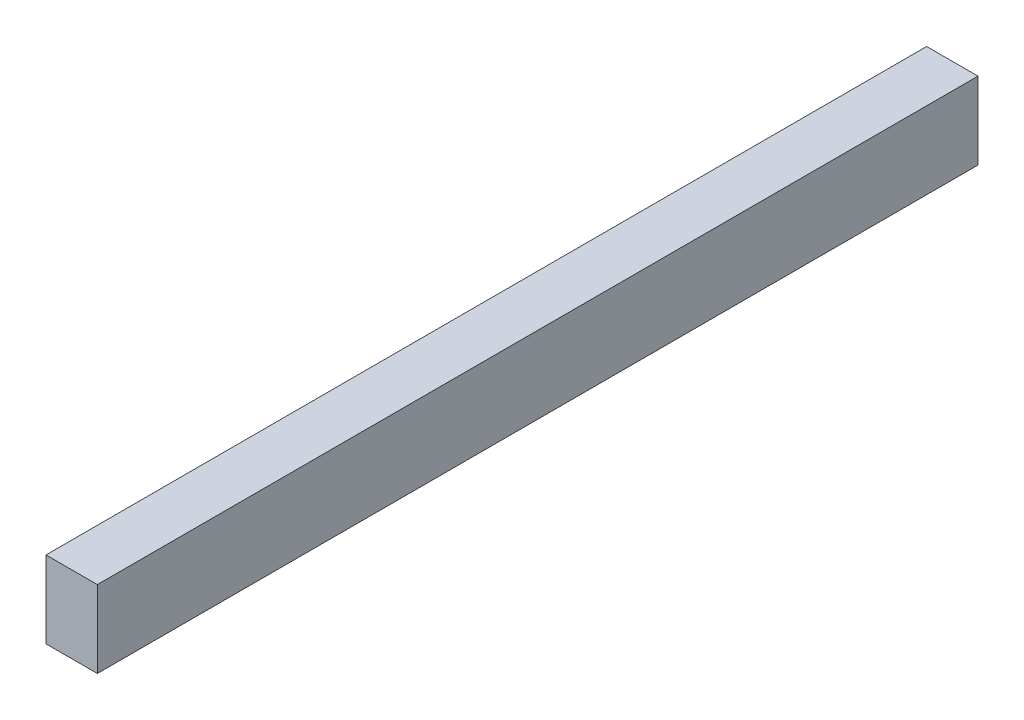
ISO-10303-21;
HEADER;
FILE_DESCRIPTION(('STEP AP214'),'2;1');
FILE_NAME('part.step','',(''),(''),'','','');
FILE_SCHEMA(('AUTOMOTIVE_DESIGN { 1 0 10303 214 1 1 1 1 }'));
ENDSEC;
DATA;
#1=APPLICATION_CONTEXT('core data for automotive mechanical design processes');
#2=APPLICATION_PROTOCOL_DEFINITION('international standard','automotive_design',2000,#1);
#3=PRODUCT_CONTEXT('',#1,'mechanical');
#4=PRODUCT('Part','Part','',(#3));
#5=PRODUCT_RELATED_PRODUCT_CATEGORY('part','',(#4));
#6=PRODUCT_DEFINITION_FORMATION('','',#4);
#7=PRODUCT_DEFINITION_CONTEXT('part definition',#1,'design');
#8=PRODUCT_DEFINITION('design','',#6,#7);
#9=PRODUCT_DEFINITION_SHAPE('','',#8);
#10=(LENGTH_UNIT() NAMED_UNIT(*) SI_UNIT(.MILLI.,.METRE.));
#11=(NAMED_UNIT(*) PLANE_ANGLE_UNIT() SI_UNIT($,.RADIAN.));
#12=(NAMED_UNIT(*) SI_UNIT($,.STERADIAN.) SOLID_ANGLE_UNIT());
#13=UNCERTAINTY_MEASURE_WITH_UNIT(LENGTH_MEASURE(1.E-05),#10,'distance_accuracy_value','');
#14=(GEOMETRIC_REPRESENTATION_CONTEXT(3) GLOBAL_UNCERTAINTY_ASSIGNED_CONTEXT((#13)) GLOBAL_UNIT_ASSIGNED_CONTEXT((#10,
#11,#12)) REPRESENTATION_CONTEXT('',''));
#15=CARTESIAN_POINT('',(0.,0.,0.));
#16=DIRECTION('',(0.,0.,1.));
#17=DIRECTION('',(1.,0.,0.));
#18=AXIS2_PLACEMENT_3D('',#15,#16,#17);
#19=CARTESIAN_POINT('',(0.,0.,871.22));
#20=DIRECTION('',(1.,0.,0.));
#21=DIRECTION('',(0.,0.,-1.));
#22=AXIS2_PLACEMENT_3D('',#19,#20,#21);
#23=PLANE('',#22);
#24=DIRECTION('',(0.,-1.,0.));
#25=VECTOR('',#24,1.);
#26=CARTESIAN_POINT('',(0.,0.,0.));
#27=LINE('',#26,#25);
#28=CARTESIAN_POINT('',(0.,76.2,0.));
#29=VERTEX_POINT('',#28);
#30=CARTESIAN_POINT('',(0.,0.,0.));
#31=VERTEX_POINT('',#30);
#32=EDGE_CURVE('E96',#29,#31,#27,.T.);
#33=ORIENTED_EDGE('',*,*,#32,.T.);
#34=DIRECTION('',(0.,0.,-1.));
#35=VECTOR('',#34,1.);
#36=CARTESIAN_POINT('',(0.,0.,871.22));
#37=LINE('',#36,#35);
#38=CARTESIAN_POINT('',(0.,0.,871.22));
#39=VERTEX_POINT('',#38);
#40=EDGE_CURVE('E11',#39,#31,#37,.T.);
#41=ORIENTED_EDGE('',*,*,#40,.F.);
#42=DIRECTION('',(0.,-1.,0.));
#43=VECTOR('',#42,1.);
#44=CARTESIAN_POINT('',(0.,0.,871.22));
#45=LINE('',#44,#43);
#46=CARTESIAN_POINT('',(0.,76.2,871.22));
#47=VERTEX_POINT('',#46);
#48=EDGE_CURVE('E84',#47,#39,#45,.T.);
#49=ORIENTED_EDGE('',*,*,#48,.F.);
#50=DIRECTION('',(0.,0.,-1.));
#51=VECTOR('',#50,1.);
#52=CARTESIAN_POINT('',(0.,76.2,871.22));
#53=LINE('',#52,#51);
#54=EDGE_CURVE('E92',#47,#29,#53,.T.);
#55=ORIENTED_EDGE('',*,*,#54,.T.);
#56=EDGE_LOOP('',(#33,#41,#49,#55));
#57=FACE_BOUND('',#56,.T.);
#58=ADVANCED_FACE('F33',(#57),#23,.F.);
#59=CARTESIAN_POINT('',(0.,0.,871.22));
#60=DIRECTION('',(0.,1.,0.));
#61=DIRECTION('',(0.,0.,1.));
#62=AXIS2_PLACEMENT_3D('',#59,#60,#61);
#63=PLANE('',#62);
#64=DIRECTION('',(1.,0.,0.));
#65=VECTOR('',#64,1.);
#66=CARTESIAN_POINT('',(0.,0.,0.));
#67=LINE('',#66,#65);
#68=CARTESIAN_POINT('',(50.8,0.,0.));
#69=VERTEX_POINT('',#68);
#70=EDGE_CURVE('E88',#31,#69,#67,.T.);
#71=ORIENTED_EDGE('',*,*,#70,.T.);
#72=DIRECTION('',(0.,0.,-1.));
#73=VECTOR('',#72,1.);
#74=CARTESIAN_POINT('',(50.8,0.,871.22));
#75=LINE('',#74,#73);
#76=CARTESIAN_POINT('',(50.8,0.,871.22));
#77=VERTEX_POINT('',#76);
#78=EDGE_CURVE('E41',#77,#69,#75,.T.);
#79=ORIENTED_EDGE('',*,*,#78,.F.);
#80=DIRECTION('',(1.,0.,0.));
#81=VECTOR('',#80,1.);
#82=CARTESIAN_POINT('',(0.,0.,871.22));
#83=LINE('',#82,#81);
#84=EDGE_CURVE('E79',#39,#77,#83,.T.);
#85=ORIENTED_EDGE('',*,*,#84,.F.);
#86=ORIENTED_EDGE('',*,*,#40,.T.);
#87=EDGE_LOOP('',(#71,#79,#85,#86));
#88=FACE_BOUND('',#87,.T.);
#89=ADVANCED_FACE('F87',(#88),#63,.F.);
#90=CARTESIAN_POINT('',(50.8,0.,871.22));
#91=DIRECTION('',(-1.,0.,0.));
#92=DIRECTION('',(0.,0.,1.));
#93=AXIS2_PLACEMENT_3D('',#90,#91,#92);
#94=PLANE('',#93);
#95=DIRECTION('',(0.,1.,0.));
#96=VECTOR('',#95,1.);
#97=CARTESIAN_POINT('',(50.8,0.,0.));
#98=LINE('',#97,#96);
#99=CARTESIAN_POINT('',(50.8,76.2,0.));
#100=VERTEX_POINT('',#99);
#101=EDGE_CURVE('E66',#69,#100,#98,.T.);
#102=ORIENTED_EDGE('',*,*,#101,.T.);
#103=DIRECTION('',(0.,0.,-1.));
#104=VECTOR('',#103,1.);
#105=CARTESIAN_POINT('',(50.8,76.2,871.22));
#106=LINE('',#105,#104);
#107=CARTESIAN_POINT('',(50.8,76.2,871.22));
#108=VERTEX_POINT('',#107);
#109=EDGE_CURVE('E89',#108,#100,#106,.T.);
#110=ORIENTED_EDGE('',*,*,#109,.F.);
#111=DIRECTION('',(0.,1.,0.));
#112=VECTOR('',#111,1.);
#113=CARTESIAN_POINT('',(50.8,0.,871.22));
#114=LINE('',#113,#112);
#115=EDGE_CURVE('E82',#77,#108,#114,.T.);
#116=ORIENTED_EDGE('',*,*,#115,.F.);
#117=ORIENTED_EDGE('',*,*,#78,.T.);
#118=EDGE_LOOP('',(#102,#110,#116,#117));
#119=FACE_BOUND('',#118,.T.);
#120=ADVANCED_FACE('F90',(#119),#94,.F.);
#121=CARTESIAN_POINT('',(0.,76.2,871.22));
#122=DIRECTION('',(0.,-1.,0.));
#123=DIRECTION('',(0.,0.,-1.));
#124=AXIS2_PLACEMENT_3D('',#121,#122,#123);
#125=PLANE('',#124);
#126=DIRECTION('',(-1.,0.,0.));
#127=VECTOR('',#126,1.);
#128=CARTESIAN_POINT('',(0.,76.2,0.));
#129=LINE('',#128,#127);
#130=EDGE_CURVE('E72',#100,#29,#129,.T.);
#131=ORIENTED_EDGE('',*,*,#130,.T.);
#132=ORIENTED_EDGE('',*,*,#54,.F.);
#133=DIRECTION('',(-1.,0.,0.));
#134=VECTOR('',#133,1.);
#135=CARTESIAN_POINT('',(0.,76.2,871.22));
#136=LINE('',#135,#134);
#137=EDGE_CURVE('E49',#108,#47,#136,.T.);
#138=ORIENTED_EDGE('',*,*,#137,.F.);
#139=ORIENTED_EDGE('',*,*,#109,.T.);
#140=EDGE_LOOP('',(#131,#132,#138,#139));
#141=FACE_BOUND('',#140,.T.);
#142=ADVANCED_FACE('F103',(#141),#125,.F.);
#143=CARTESIAN_POINT('',(0.,0.,871.22));
#144=DIRECTION('',(0.,0.,-1.));
#145=DIRECTION('',(-1.,0.,0.));
#146=AXIS2_PLACEMENT_3D('',#143,#144,#145);
#147=PLANE('',#146);
#148=ORIENTED_EDGE('',*,*,#48,.T.);
#149=ORIENTED_EDGE('',*,*,#84,.T.);
#150=ORIENTED_EDGE('',*,*,#115,.T.);
#151=ORIENTED_EDGE('',*,*,#137,.T.);
#152=EDGE_LOOP('',(#148,#149,#150,#151));
#153=FACE_BOUND('',#152,.T.);
#154=ADVANCED_FACE('F80',(#153),#147,.F.);
#155=CARTESIAN_POINT('',(0.,0.,0.));
#156=DIRECTION('',(0.,0.,-1.));
#157=DIRECTION('',(-1.,0.,0.));
#158=AXIS2_PLACEMENT_3D('',#155,#156,#157);
#159=PLANE('',#158);
#160=ORIENTED_EDGE('',*,*,#32,.F.);
#161=ORIENTED_EDGE('',*,*,#130,.F.);
#162=ORIENTED_EDGE('',*,*,#101,.F.);
#163=ORIENTED_EDGE('',*,*,#70,.F.);
#164=EDGE_LOOP('',(#160,#161,#162,#163));
#165=FACE_BOUND('',#164,.T.);
#166=ADVANCED_FACE('F106',(#165),#159,.T.);
#167=CLOSED_SHELL('',(#58,#89,#120,#142,#154,#166));
#168=MANIFOLD_SOLID_BREP('B2',#167);
#169=ADVANCED_BREP_SHAPE_REPRESENTATION('',(#18,#168),#14);
#170=SHAPE_DEFINITION_REPRESENTATION(#9,#169);
ENDSEC;
END-ISO-10303-21;
